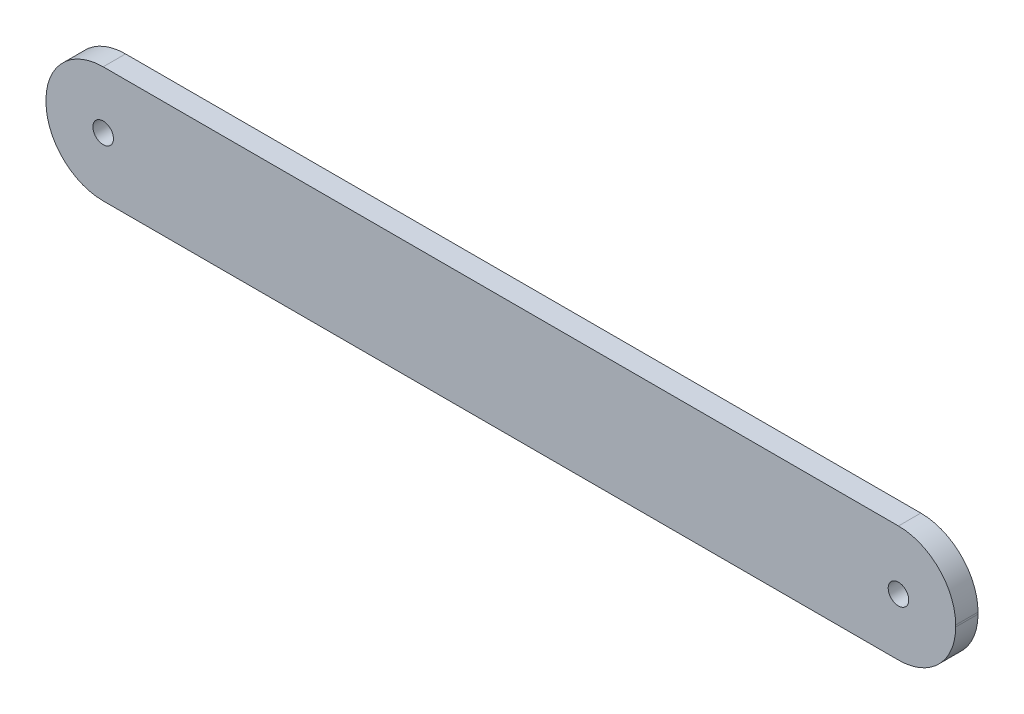
ISO-10303-21;
HEADER;
FILE_DESCRIPTION(('STEP AP214'),'2;1');
FILE_NAME('part.step','',(''),(''),'','','');
FILE_SCHEMA(('AUTOMOTIVE_DESIGN { 1 0 10303 214 1 1 1 1 }'));
ENDSEC;
DATA;
#1=APPLICATION_CONTEXT('core data for automotive mechanical design processes');
#2=APPLICATION_PROTOCOL_DEFINITION('international standard','automotive_design',2000,#1);
#3=PRODUCT_CONTEXT('',#1,'mechanical');
#4=PRODUCT('Part','Part','',(#3));
#5=PRODUCT_RELATED_PRODUCT_CATEGORY('part','',(#4));
#6=PRODUCT_DEFINITION_FORMATION('','',#4);
#7=PRODUCT_DEFINITION_CONTEXT('part definition',#1,'design');
#8=PRODUCT_DEFINITION('design','',#6,#7);
#9=PRODUCT_DEFINITION_SHAPE('','',#8);
#10=(LENGTH_UNIT() NAMED_UNIT(*) SI_UNIT(.MILLI.,.METRE.));
#11=(NAMED_UNIT(*) PLANE_ANGLE_UNIT() SI_UNIT($,.RADIAN.));
#12=(NAMED_UNIT(*) SI_UNIT($,.STERADIAN.) SOLID_ANGLE_UNIT());
#13=UNCERTAINTY_MEASURE_WITH_UNIT(LENGTH_MEASURE(1.E-05),#10,'distance_accuracy_value','');
#14=(GEOMETRIC_REPRESENTATION_CONTEXT(3) GLOBAL_UNCERTAINTY_ASSIGNED_CONTEXT((#13)) GLOBAL_UNIT_ASSIGNED_CONTEXT((#10,
#11,#12)) REPRESENTATION_CONTEXT('',''));
#15=CARTESIAN_POINT('',(0.,0.,0.));
#16=DIRECTION('',(0.,0.,1.));
#17=DIRECTION('',(1.,0.,0.));
#18=AXIS2_PLACEMENT_3D('',#15,#16,#17);
#19=CARTESIAN_POINT('',(64.643,-8.255,3.175));
#20=DIRECTION('',(-1.,0.,0.));
#21=DIRECTION('',(0.,0.,1.));
#22=AXIS2_PLACEMENT_3D('',#19,#20,#21);
#23=PLANE('',#22);
#24=DIRECTION('',(0.,1.,0.));
#25=VECTOR('',#24,1.);
#26=CARTESIAN_POINT('',(64.643,-8.255,3.175));
#27=LINE('',#26,#25);
#28=CARTESIAN_POINT('',(64.643,-0.127000000000002,3.175));
#29=VERTEX_POINT('',#28);
#30=CARTESIAN_POINT('',(64.643,0.126999999999999,3.175));
#31=VERTEX_POINT('',#30);
#32=EDGE_CURVE('E135',#29,#31,#27,.T.);
#33=ORIENTED_EDGE('',*,*,#32,.F.);
#34=DIRECTION('',(0.,0.,-1.));
#35=VECTOR('',#34,1.);
#36=CARTESIAN_POINT('',(64.643,-0.127000000000002,3.175));
#37=LINE('',#36,#35);
#38=CARTESIAN_POINT('',(64.643,-0.127000000000002,0.));
#39=VERTEX_POINT('',#38);
#40=EDGE_CURVE('E11',#29,#39,#37,.T.);
#41=ORIENTED_EDGE('',*,*,#40,.T.);
#42=DIRECTION('',(0.,1.,0.));
#43=VECTOR('',#42,1.);
#44=CARTESIAN_POINT('',(64.643,-8.255,0.));
#45=LINE('',#44,#43);
#46=CARTESIAN_POINT('',(64.643,0.126999999999999,0.));
#47=VERTEX_POINT('',#46);
#48=EDGE_CURVE('E163',#39,#47,#45,.T.);
#49=ORIENTED_EDGE('',*,*,#48,.T.);
#50=DIRECTION('',(0.,0.,-1.));
#51=VECTOR('',#50,1.);
#52=CARTESIAN_POINT('',(64.643,0.126999999999999,3.175));
#53=LINE('',#52,#51);
#54=EDGE_CURVE('E50',#47,#31,#53,.F.);
#55=ORIENTED_EDGE('',*,*,#54,.T.);
#56=EDGE_LOOP('',(#33,#41,#49,#55));
#57=FACE_BOUND('',#56,.T.);
#58=ADVANCED_FACE('F39',(#57),#23,.F.);
#59=CARTESIAN_POINT('',(-64.643,8.255,3.175));
#60=DIRECTION('',(0.,-1.,0.));
#61=DIRECTION('',(0.,0.,-1.));
#62=AXIS2_PLACEMENT_3D('',#59,#60,#61);
#63=PLANE('',#62);
#64=DIRECTION('',(-1.,0.,0.));
#65=VECTOR('',#64,1.);
#66=CARTESIAN_POINT('',(-64.643,8.255,0.));
#67=LINE('',#66,#65);
#68=CARTESIAN_POINT('',(56.515,8.255,0.));
#69=VERTEX_POINT('',#68);
#70=CARTESIAN_POINT('',(-56.515,8.255,0.));
#71=VERTEX_POINT('',#70);
#72=EDGE_CURVE('E137',#69,#71,#67,.T.);
#73=ORIENTED_EDGE('',*,*,#72,.T.);
#74=DIRECTION('',(0.,0.,-1.));
#75=VECTOR('',#74,1.);
#76=CARTESIAN_POINT('',(-56.515,8.255,3.175));
#77=LINE('',#76,#75);
#78=CARTESIAN_POINT('',(-56.515,8.255,3.175));
#79=VERTEX_POINT('',#78);
#80=EDGE_CURVE('E53',#71,#79,#77,.F.);
#81=ORIENTED_EDGE('',*,*,#80,.T.);
#82=DIRECTION('',(-1.,0.,0.));
#83=VECTOR('',#82,1.);
#84=CARTESIAN_POINT('',(-64.643,8.255,3.175));
#85=LINE('',#84,#83);
#86=CARTESIAN_POINT('',(56.515,8.255,3.175));
#87=VERTEX_POINT('',#86);
#88=EDGE_CURVE('E138',#87,#79,#85,.T.);
#89=ORIENTED_EDGE('',*,*,#88,.F.);
#90=DIRECTION('',(0.,0.,-1.));
#91=VECTOR('',#90,1.);
#92=CARTESIAN_POINT('',(56.515,8.255,3.175));
#93=LINE('',#92,#91);
#94=EDGE_CURVE('E156',#87,#69,#93,.T.);
#95=ORIENTED_EDGE('',*,*,#94,.T.);
#96=EDGE_LOOP('',(#73,#81,#89,#95));
#97=FACE_BOUND('',#96,.T.);
#98=ADVANCED_FACE('F174',(#97),#63,.F.);
#99=CARTESIAN_POINT('',(-64.643,-8.255,3.175));
#100=DIRECTION('',(1.,0.,0.));
#101=DIRECTION('',(0.,0.,-1.));
#102=AXIS2_PLACEMENT_3D('',#99,#100,#101);
#103=PLANE('',#102);
#104=DIRECTION('',(0.,-1.,0.));
#105=VECTOR('',#104,1.);
#106=CARTESIAN_POINT('',(-64.643,-8.255,0.));
#107=LINE('',#106,#105);
#108=CARTESIAN_POINT('',(-64.643,0.126999999999999,0.));
#109=VERTEX_POINT('',#108);
#110=CARTESIAN_POINT('',(-64.643,-0.127000000000002,0.));
#111=VERTEX_POINT('',#110);
#112=EDGE_CURVE('E133',#109,#111,#107,.T.);
#113=ORIENTED_EDGE('',*,*,#112,.T.);
#114=DIRECTION('',(0.,0.,-1.));
#115=VECTOR('',#114,1.);
#116=CARTESIAN_POINT('',(-64.643,-0.127000000000002,3.175));
#117=LINE('',#116,#115);
#118=CARTESIAN_POINT('',(-64.643,-0.127000000000002,3.175));
#119=VERTEX_POINT('',#118);
#120=EDGE_CURVE('E112',#111,#119,#117,.F.);
#121=ORIENTED_EDGE('',*,*,#120,.T.);
#122=DIRECTION('',(0.,-1.,0.));
#123=VECTOR('',#122,1.);
#124=CARTESIAN_POINT('',(-64.643,-8.255,3.175));
#125=LINE('',#124,#123);
#126=CARTESIAN_POINT('',(-64.643,0.126999999999999,3.175));
#127=VERTEX_POINT('',#126);
#128=EDGE_CURVE('E178',#127,#119,#125,.T.);
#129=ORIENTED_EDGE('',*,*,#128,.F.);
#130=DIRECTION('',(0.,0.,-1.));
#131=VECTOR('',#130,1.);
#132=CARTESIAN_POINT('',(-64.643,0.126999999999999,3.175));
#133=LINE('',#132,#131);
#134=EDGE_CURVE('E119',#127,#109,#133,.T.);
#135=ORIENTED_EDGE('',*,*,#134,.T.);
#136=EDGE_LOOP('',(#113,#121,#129,#135));
#137=FACE_BOUND('',#136,.T.);
#138=ADVANCED_FACE('F218',(#137),#103,.F.);
#139=CARTESIAN_POINT('',(-64.643,-8.255,3.175));
#140=DIRECTION('',(0.,1.,0.));
#141=DIRECTION('',(0.,0.,1.));
#142=AXIS2_PLACEMENT_3D('',#139,#140,#141);
#143=PLANE('',#142);
#144=DIRECTION('',(1.,0.,0.));
#145=VECTOR('',#144,1.);
#146=CARTESIAN_POINT('',(-64.643,-8.255,3.175));
#147=LINE('',#146,#145);
#148=CARTESIAN_POINT('',(-56.515,-8.255,3.175));
#149=VERTEX_POINT('',#148);
#150=CARTESIAN_POINT('',(56.515,-8.255,3.175));
#151=VERTEX_POINT('',#150);
#152=EDGE_CURVE('E127',#149,#151,#147,.T.);
#153=ORIENTED_EDGE('',*,*,#152,.F.);
#154=DIRECTION('',(0.,0.,-1.));
#155=VECTOR('',#154,1.);
#156=CARTESIAN_POINT('',(-56.515,-8.255,3.175));
#157=LINE('',#156,#155);
#158=CARTESIAN_POINT('',(-56.515,-8.255,0.));
#159=VERTEX_POINT('',#158);
#160=EDGE_CURVE('E109',#149,#159,#157,.T.);
#161=ORIENTED_EDGE('',*,*,#160,.T.);
#162=DIRECTION('',(1.,0.,0.));
#163=VECTOR('',#162,1.);
#164=CARTESIAN_POINT('',(-64.643,-8.255,0.));
#165=LINE('',#164,#163);
#166=CARTESIAN_POINT('',(56.515,-8.255,0.));
#167=VERTEX_POINT('',#166);
#168=EDGE_CURVE('E122',#159,#167,#165,.T.);
#169=ORIENTED_EDGE('',*,*,#168,.T.);
#170=DIRECTION('',(0.,0.,-1.));
#171=VECTOR('',#170,1.);
#172=CARTESIAN_POINT('',(56.515,-8.255,3.175));
#173=LINE('',#172,#171);
#174=EDGE_CURVE('E126',#167,#151,#173,.F.);
#175=ORIENTED_EDGE('',*,*,#174,.T.);
#176=EDGE_LOOP('',(#153,#161,#169,#175));
#177=FACE_BOUND('',#176,.T.);
#178=ADVANCED_FACE('F124',(#177),#143,.F.);
#179=CARTESIAN_POINT('',(0.,0.,3.175));
#180=DIRECTION('',(0.,0.,-1.));
#181=DIRECTION('',(-1.,0.,0.));
#182=AXIS2_PLACEMENT_3D('',#179,#180,#181);
#183=PLANE('',#182);
#184=CARTESIAN_POINT('',(-56.515,0.126999999999999,3.175));
#185=DIRECTION('',(0.,0.,1.));
#186=DIRECTION('',(1.,0.,0.));
#187=AXIS2_PLACEMENT_3D('',#184,#185,#186);
#188=CIRCLE('',#187,1.46050000000001);
#189=CARTESIAN_POINT('',(-55.0545,0.126999999999999,3.175));
#190=VERTEX_POINT('',#189);
#191=EDGE_CURVE('E183',#190,#190,#188,.T.);
#192=ORIENTED_EDGE('',*,*,#191,.F.);
#193=EDGE_LOOP('',(#192));
#194=FACE_BOUND('',#193,.T.);
#195=CARTESIAN_POINT('',(56.515,-0.127000000000002,3.175));
#196=DIRECTION('',(0.,0.,1.));
#197=DIRECTION('',(1.,0.,0.));
#198=AXIS2_PLACEMENT_3D('',#195,#196,#197);
#199=CIRCLE('',#198,1.46050000000001);
#200=CARTESIAN_POINT('',(57.9755,-0.127000000000002,3.175));
#201=VERTEX_POINT('',#200);
#202=EDGE_CURVE('E185',#201,#201,#199,.T.);
#203=ORIENTED_EDGE('',*,*,#202,.F.);
#204=EDGE_LOOP('',(#203));
#205=FACE_BOUND('',#204,.T.);
#206=ORIENTED_EDGE('',*,*,#128,.T.);
#207=CARTESIAN_POINT('',(-56.515,-0.127000000000002,3.175));
#208=DIRECTION('',(0.,0.,-1.));
#209=DIRECTION('',(-1.,0.,0.));
#210=AXIS2_PLACEMENT_3D('',#207,#208,#209);
#211=CIRCLE('',#210,8.128);
#212=EDGE_CURVE('E152',#119,#149,#211,.F.);
#213=ORIENTED_EDGE('',*,*,#212,.T.);
#214=ORIENTED_EDGE('',*,*,#152,.T.);
#215=CARTESIAN_POINT('',(56.515,-0.127000000000002,3.175));
#216=DIRECTION('',(0.,0.,-1.));
#217=DIRECTION('',(-1.,0.,0.));
#218=AXIS2_PLACEMENT_3D('',#215,#216,#217);
#219=CIRCLE('',#218,8.128);
#220=EDGE_CURVE('E147',#151,#29,#219,.F.);
#221=ORIENTED_EDGE('',*,*,#220,.T.);
#222=ORIENTED_EDGE('',*,*,#32,.T.);
#223=CARTESIAN_POINT('',(56.515,0.126999999999999,3.175));
#224=DIRECTION('',(0.,0.,-1.));
#225=DIRECTION('',(-1.,0.,0.));
#226=AXIS2_PLACEMENT_3D('',#223,#224,#225);
#227=CIRCLE('',#226,8.128);
#228=EDGE_CURVE('E64',#31,#87,#227,.F.);
#229=ORIENTED_EDGE('',*,*,#228,.T.);
#230=ORIENTED_EDGE('',*,*,#88,.T.);
#231=CARTESIAN_POINT('',(-56.515,0.126999999999999,3.175));
#232=DIRECTION('',(0.,0.,-1.));
#233=DIRECTION('',(-1.,0.,0.));
#234=AXIS2_PLACEMENT_3D('',#231,#232,#233);
#235=CIRCLE('',#234,8.128);
#236=EDGE_CURVE('E155',#79,#127,#235,.F.);
#237=ORIENTED_EDGE('',*,*,#236,.T.);
#238=EDGE_LOOP('',(#206,#213,#214,#221,#222,#229,#230,#237));
#239=FACE_BOUND('',#238,.T.);
#240=ADVANCED_FACE('F170',(#194,#205,#239),#183,.F.);
#241=CARTESIAN_POINT('',(0.,0.,0.));
#242=DIRECTION('',(0.,0.,-1.));
#243=DIRECTION('',(-1.,0.,0.));
#244=AXIS2_PLACEMENT_3D('',#241,#242,#243);
#245=PLANE('',#244);
#246=CARTESIAN_POINT('',(-56.515,0.126999999999999,0.));
#247=DIRECTION('',(0.,0.,1.));
#248=DIRECTION('',(1.,0.,0.));
#249=AXIS2_PLACEMENT_3D('',#246,#247,#248);
#250=CIRCLE('',#249,1.46050000000001);
#251=CARTESIAN_POINT('',(-55.0545,0.126999999999999,0.));
#252=VERTEX_POINT('',#251);
#253=EDGE_CURVE('E171',#252,#252,#250,.T.);
#254=ORIENTED_EDGE('',*,*,#253,.T.);
#255=EDGE_LOOP('',(#254));
#256=FACE_BOUND('',#255,.T.);
#257=CARTESIAN_POINT('',(56.515,-0.127000000000002,0.));
#258=DIRECTION('',(0.,0.,1.));
#259=DIRECTION('',(1.,0.,0.));
#260=AXIS2_PLACEMENT_3D('',#257,#258,#259);
#261=CIRCLE('',#260,1.46050000000001);
#262=CARTESIAN_POINT('',(57.9755,-0.127000000000002,0.));
#263=VERTEX_POINT('',#262);
#264=EDGE_CURVE('E180',#263,#263,#261,.T.);
#265=ORIENTED_EDGE('',*,*,#264,.T.);
#266=EDGE_LOOP('',(#265));
#267=FACE_BOUND('',#266,.T.);
#268=ORIENTED_EDGE('',*,*,#168,.F.);
#269=CARTESIAN_POINT('',(-56.515,-0.127000000000002,0.));
#270=DIRECTION('',(0.,0.,-1.));
#271=DIRECTION('',(-1.,0.,0.));
#272=AXIS2_PLACEMENT_3D('',#269,#270,#271);
#273=CIRCLE('',#272,8.128);
#274=EDGE_CURVE('E106',#159,#111,#273,.T.);
#275=ORIENTED_EDGE('',*,*,#274,.T.);
#276=ORIENTED_EDGE('',*,*,#112,.F.);
#277=CARTESIAN_POINT('',(-56.515,0.126999999999999,0.));
#278=DIRECTION('',(0.,0.,-1.));
#279=DIRECTION('',(-1.,0.,0.));
#280=AXIS2_PLACEMENT_3D('',#277,#278,#279);
#281=CIRCLE('',#280,8.128);
#282=EDGE_CURVE('E116',#109,#71,#281,.T.);
#283=ORIENTED_EDGE('',*,*,#282,.T.);
#284=ORIENTED_EDGE('',*,*,#72,.F.);
#285=CARTESIAN_POINT('',(56.515,0.126999999999999,0.));
#286=DIRECTION('',(0.,0.,-1.));
#287=DIRECTION('',(-1.,0.,0.));
#288=AXIS2_PLACEMENT_3D('',#285,#286,#287);
#289=CIRCLE('',#288,8.128);
#290=EDGE_CURVE('E130',#69,#47,#289,.T.);
#291=ORIENTED_EDGE('',*,*,#290,.T.);
#292=ORIENTED_EDGE('',*,*,#48,.F.);
#293=CARTESIAN_POINT('',(56.515,-0.127000000000002,0.));
#294=DIRECTION('',(0.,0.,-1.));
#295=DIRECTION('',(-1.,0.,0.));
#296=AXIS2_PLACEMENT_3D('',#293,#294,#295);
#297=CIRCLE('',#296,8.128);
#298=EDGE_CURVE('E131',#39,#167,#297,.T.);
#299=ORIENTED_EDGE('',*,*,#298,.T.);
#300=EDGE_LOOP('',(#268,#275,#276,#283,#284,#291,#292,#299));
#301=FACE_BOUND('',#300,.T.);
#302=ADVANCED_FACE('F128',(#256,#267,#301),#245,.T.);
#303=CARTESIAN_POINT('',(-56.515,-0.127000000000002,3.175));
#304=DIRECTION('',(0.,0.,-1.));
#305=DIRECTION('',(-1.,0.,0.));
#306=AXIS2_PLACEMENT_3D('',#303,#304,#305);
#307=CYLINDRICAL_SURFACE('',#306,8.128);
#308=ORIENTED_EDGE('',*,*,#212,.F.);
#309=ORIENTED_EDGE('',*,*,#120,.F.);
#310=ORIENTED_EDGE('',*,*,#274,.F.);
#311=ORIENTED_EDGE('',*,*,#160,.F.);
#312=EDGE_LOOP('',(#308,#309,#310,#311));
#313=FACE_BOUND('',#312,.T.);
#314=ADVANCED_FACE('F108',(#313),#307,.T.);
#315=CARTESIAN_POINT('',(-56.515,0.126999999999999,3.175));
#316=DIRECTION('',(0.,0.,-1.));
#317=DIRECTION('',(-1.,0.,0.));
#318=AXIS2_PLACEMENT_3D('',#315,#316,#317);
#319=CYLINDRICAL_SURFACE('',#318,8.128);
#320=ORIENTED_EDGE('',*,*,#236,.F.);
#321=ORIENTED_EDGE('',*,*,#80,.F.);
#322=ORIENTED_EDGE('',*,*,#282,.F.);
#323=ORIENTED_EDGE('',*,*,#134,.F.);
#324=EDGE_LOOP('',(#320,#321,#322,#323));
#325=FACE_BOUND('',#324,.T.);
#326=ADVANCED_FACE('F223',(#325),#319,.T.);
#327=CARTESIAN_POINT('',(56.515,-0.127000000000002,3.175));
#328=DIRECTION('',(0.,0.,-1.));
#329=DIRECTION('',(-1.,0.,0.));
#330=AXIS2_PLACEMENT_3D('',#327,#328,#329);
#331=CYLINDRICAL_SURFACE('',#330,8.128);
#332=ORIENTED_EDGE('',*,*,#220,.F.);
#333=ORIENTED_EDGE('',*,*,#174,.F.);
#334=ORIENTED_EDGE('',*,*,#298,.F.);
#335=ORIENTED_EDGE('',*,*,#40,.F.);
#336=EDGE_LOOP('',(#332,#333,#334,#335));
#337=FACE_BOUND('',#336,.T.);
#338=ADVANCED_FACE('F215',(#337),#331,.T.);
#339=CARTESIAN_POINT('',(56.515,0.126999999999999,3.175));
#340=DIRECTION('',(0.,0.,-1.));
#341=DIRECTION('',(-1.,0.,0.));
#342=AXIS2_PLACEMENT_3D('',#339,#340,#341);
#343=CYLINDRICAL_SURFACE('',#342,8.128);
#344=ORIENTED_EDGE('',*,*,#228,.F.);
#345=ORIENTED_EDGE('',*,*,#54,.F.);
#346=ORIENTED_EDGE('',*,*,#290,.F.);
#347=ORIENTED_EDGE('',*,*,#94,.F.);
#348=EDGE_LOOP('',(#344,#345,#346,#347));
#349=FACE_BOUND('',#348,.T.);
#350=ADVANCED_FACE('F41',(#349),#343,.T.);
#351=CARTESIAN_POINT('',(56.515,-0.127000000000002,0.));
#352=DIRECTION('',(0.,0.,1.));
#353=DIRECTION('',(1.,0.,0.));
#354=AXIS2_PLACEMENT_3D('',#351,#352,#353);
#355=CYLINDRICAL_SURFACE('',#354,1.46050000000001);
#356=ORIENTED_EDGE('',*,*,#264,.F.);
#357=EDGE_LOOP('',(#356));
#358=FACE_BOUND('',#357,.T.);
#359=ORIENTED_EDGE('',*,*,#202,.T.);
#360=EDGE_LOOP('',(#359));
#361=FACE_BOUND('',#360,.T.);
#362=ADVANCED_FACE('F198',(#358,#361),#355,.F.);
#363=CARTESIAN_POINT('',(-56.515,0.126999999999999,0.));
#364=DIRECTION('',(0.,0.,1.));
#365=DIRECTION('',(1.,0.,0.));
#366=AXIS2_PLACEMENT_3D('',#363,#364,#365);
#367=CYLINDRICAL_SURFACE('',#366,1.46050000000001);
#368=ORIENTED_EDGE('',*,*,#253,.F.);
#369=EDGE_LOOP('',(#368));
#370=FACE_BOUND('',#369,.T.);
#371=ORIENTED_EDGE('',*,*,#191,.T.);
#372=EDGE_LOOP('',(#371));
#373=FACE_BOUND('',#372,.T.);
#374=ADVANCED_FACE('F192',(#370,#373),#367,.F.);
#375=CLOSED_SHELL('',(#58,#98,#138,#178,#240,#302,#314,#326,#338,#350,#362,#374));
#376=MANIFOLD_SOLID_BREP('B2',#375);
#377=ADVANCED_BREP_SHAPE_REPRESENTATION('',(#18,#376),#14);
#378=SHAPE_DEFINITION_REPRESENTATION(#9,#377);
ENDSEC;
END-ISO-10303-21;
